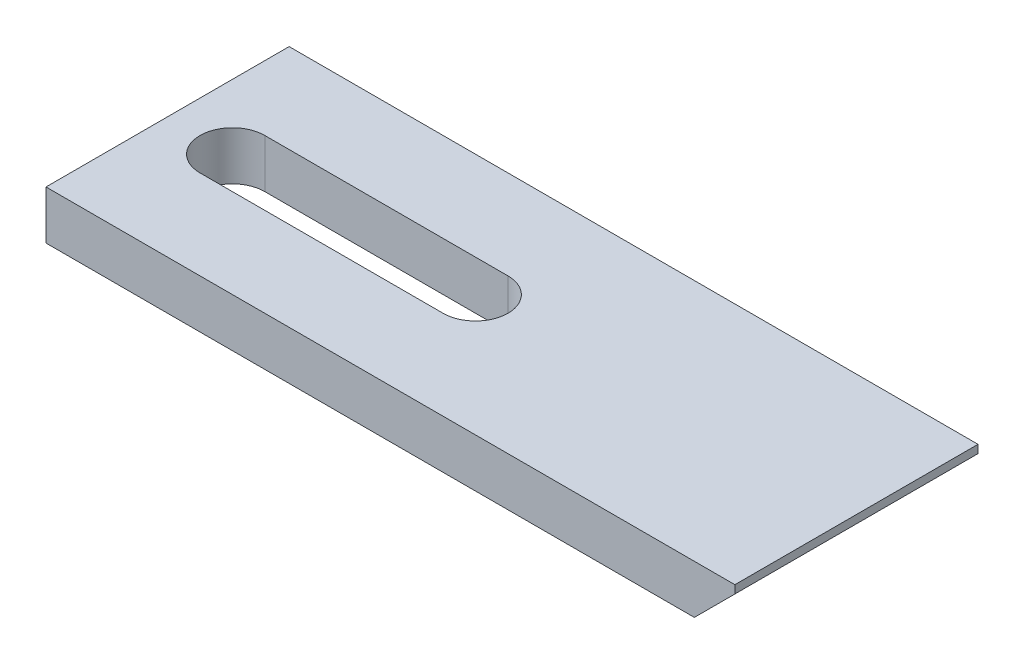
ISO-10303-21;
HEADER;
FILE_DESCRIPTION(('STEP AP214'),'2;1');
FILE_NAME('part.step','',(''),(''),'','','');
FILE_SCHEMA(('AUTOMOTIVE_DESIGN { 1 0 10303 214 1 1 1 1 }'));
ENDSEC;
DATA;
#1=APPLICATION_CONTEXT('core data for automotive mechanical design processes');
#2=APPLICATION_PROTOCOL_DEFINITION('international standard','automotive_design',2000,#1);
#3=PRODUCT_CONTEXT('',#1,'mechanical');
#4=PRODUCT('Part','Part','',(#3));
#5=PRODUCT_RELATED_PRODUCT_CATEGORY('part','',(#4));
#6=PRODUCT_DEFINITION_FORMATION('','',#4);
#7=PRODUCT_DEFINITION_CONTEXT('part definition',#1,'design');
#8=PRODUCT_DEFINITION('design','',#6,#7);
#9=PRODUCT_DEFINITION_SHAPE('','',#8);
#10=(LENGTH_UNIT() NAMED_UNIT(*) SI_UNIT(.MILLI.,.METRE.));
#11=(NAMED_UNIT(*) PLANE_ANGLE_UNIT() SI_UNIT($,.RADIAN.));
#12=(NAMED_UNIT(*) SI_UNIT($,.STERADIAN.) SOLID_ANGLE_UNIT());
#13=UNCERTAINTY_MEASURE_WITH_UNIT(LENGTH_MEASURE(1.E-05),#10,'distance_accuracy_value','');
#14=(GEOMETRIC_REPRESENTATION_CONTEXT(3) GLOBAL_UNCERTAINTY_ASSIGNED_CONTEXT((#13)) GLOBAL_UNIT_ASSIGNED_CONTEXT((#10,
#11,#12)) REPRESENTATION_CONTEXT('',''));
#15=CARTESIAN_POINT('',(0.,0.,0.));
#16=DIRECTION('',(0.,0.,1.));
#17=DIRECTION('',(1.,0.,0.));
#18=AXIS2_PLACEMENT_3D('',#15,#16,#17);
#19=CARTESIAN_POINT('',(-42.5,6.00000000000001,-15.));
#20=DIRECTION('',(0.,1.,0.));
#21=DIRECTION('',(0.,0.,-1.));
#22=AXIS2_PLACEMENT_3D('',#19,#20,#21);
#23=PLANE('',#22);
#24=DIRECTION('',(-1.,0.,0.));
#25=VECTOR('',#24,1.);
#26=CARTESIAN_POINT('',(-34.5000000000012,6.00000000000001,4.));
#27=LINE('',#26,#25);
#28=CARTESIAN_POINT('',(-4.50000000000117,6.00000000000001,4.));
#29=VERTEX_POINT('',#28);
#30=CARTESIAN_POINT('',(-34.5000000000012,6.00000000000001,4.));
#31=VERTEX_POINT('',#30);
#32=EDGE_CURVE('E148',#29,#31,#27,.T.);
#33=ORIENTED_EDGE('',*,*,#32,.T.);
#34=CARTESIAN_POINT('',(-34.5000000000001,6.00000000000001,0.));
#35=DIRECTION('',(0.,-1.,0.));
#36=DIRECTION('',(0.,0.,-1.));
#37=AXIS2_PLACEMENT_3D('',#34,#35,#36);
#38=CIRCLE('',#37,4.);
#39=CARTESIAN_POINT('',(-34.499999999999,6.00000000000001,-4.));
#40=VERTEX_POINT('',#39);
#41=EDGE_CURVE('E152',#31,#40,#38,.T.);
#42=ORIENTED_EDGE('',*,*,#41,.T.);
#43=DIRECTION('',(1.,0.,0.));
#44=VECTOR('',#43,1.);
#45=CARTESIAN_POINT('',(-34.499999999999,6.00000000000001,-4.));
#46=LINE('',#45,#44);
#47=CARTESIAN_POINT('',(-4.49999999999895,6.00000000000001,-4.));
#48=VERTEX_POINT('',#47);
#49=EDGE_CURVE('E161',#40,#48,#46,.T.);
#50=ORIENTED_EDGE('',*,*,#49,.T.);
#51=CARTESIAN_POINT('',(-4.50000000000006,6.00000000000001,0.));
#52=DIRECTION('',(0.,-1.,0.));
#53=DIRECTION('',(0.,0.,1.));
#54=AXIS2_PLACEMENT_3D('',#51,#52,#53);
#55=CIRCLE('',#54,4.);
#56=EDGE_CURVE('E168',#48,#29,#55,.T.);
#57=ORIENTED_EDGE('',*,*,#56,.T.);
#58=EDGE_LOOP('',(#33,#42,#50,#57));
#59=FACE_BOUND('',#58,.T.);
#60=DIRECTION('',(0.,0.,-1.));
#61=VECTOR('',#60,1.);
#62=CARTESIAN_POINT('',(-42.5000000000001,6.00000000000001,15.));
#63=LINE('',#62,#61);
#64=CARTESIAN_POINT('',(-42.5000000000001,6.00000000000001,15.));
#65=VERTEX_POINT('',#64);
#66=CARTESIAN_POINT('',(-42.5,6.00000000000001,-15.));
#67=VERTEX_POINT('',#66);
#68=EDGE_CURVE('E130',#65,#67,#63,.T.);
#69=ORIENTED_EDGE('',*,*,#68,.F.);
#70=DIRECTION('',(-1.,0.,0.));
#71=VECTOR('',#70,1.);
#72=CARTESIAN_POINT('',(-42.5000000000001,6.00000000000001,15.));
#73=LINE('',#72,#71);
#74=CARTESIAN_POINT('',(42.5,6.00000000000001,15.));
#75=VERTEX_POINT('',#74);
#76=EDGE_CURVE('E126',#75,#65,#73,.T.);
#77=ORIENTED_EDGE('',*,*,#76,.F.);
#78=DIRECTION('',(0.,0.,1.));
#79=VECTOR('',#78,1.);
#80=CARTESIAN_POINT('',(42.5,6.00000000000001,15.));
#81=LINE('',#80,#79);
#82=CARTESIAN_POINT('',(42.5,6.00000000000001,-15.));
#83=VERTEX_POINT('',#82);
#84=EDGE_CURVE('E122',#83,#75,#81,.T.);
#85=ORIENTED_EDGE('',*,*,#84,.F.);
#86=DIRECTION('',(1.,0.,0.));
#87=VECTOR('',#86,1.);
#88=CARTESIAN_POINT('',(-42.5,6.00000000000001,-15.));
#89=LINE('',#88,#87);
#90=EDGE_CURVE('E140',#67,#83,#89,.T.);
#91=ORIENTED_EDGE('',*,*,#90,.F.);
#92=EDGE_LOOP('',(#69,#77,#85,#91));
#93=FACE_BOUND('',#92,.T.);
#94=ADVANCED_FACE('F33',(#59,#93),#23,.T.);
#95=CARTESIAN_POINT('',(-42.5,0.,-15.));
#96=DIRECTION('',(0.,1.,0.));
#97=DIRECTION('',(0.,0.,-1.));
#98=AXIS2_PLACEMENT_3D('',#95,#96,#97);
#99=PLANE('',#98);
#100=CARTESIAN_POINT('',(-4.50000000000006,0.,0.));
#101=DIRECTION('',(0.,-1.,0.));
#102=DIRECTION('',(0.,0.,1.));
#103=AXIS2_PLACEMENT_3D('',#100,#101,#102);
#104=CIRCLE('',#103,4.);
#105=CARTESIAN_POINT('',(-4.49999999999895,0.,-4.));
#106=VERTEX_POINT('',#105);
#107=CARTESIAN_POINT('',(-4.50000000000117,0.,4.));
#108=VERTEX_POINT('',#107);
#109=EDGE_CURVE('E169',#106,#108,#104,.T.);
#110=ORIENTED_EDGE('',*,*,#109,.F.);
#111=DIRECTION('',(1.,0.,0.));
#112=VECTOR('',#111,1.);
#113=CARTESIAN_POINT('',(-34.499999999999,0.,-4.));
#114=LINE('',#113,#112);
#115=CARTESIAN_POINT('',(-34.499999999999,0.,-4.));
#116=VERTEX_POINT('',#115);
#117=EDGE_CURVE('E153',#116,#106,#114,.T.);
#118=ORIENTED_EDGE('',*,*,#117,.F.);
#119=CARTESIAN_POINT('',(-34.5000000000001,0.,0.));
#120=DIRECTION('',(0.,-1.,0.));
#121=DIRECTION('',(0.,0.,-1.));
#122=AXIS2_PLACEMENT_3D('',#119,#120,#121);
#123=CIRCLE('',#122,4.);
#124=CARTESIAN_POINT('',(-34.5000000000012,0.,4.));
#125=VERTEX_POINT('',#124);
#126=EDGE_CURVE('E155',#125,#116,#123,.T.);
#127=ORIENTED_EDGE('',*,*,#126,.F.);
#128=DIRECTION('',(-1.,0.,0.));
#129=VECTOR('',#128,1.);
#130=CARTESIAN_POINT('',(-34.5000000000012,0.,4.));
#131=LINE('',#130,#129);
#132=EDGE_CURVE('E149',#108,#125,#131,.T.);
#133=ORIENTED_EDGE('',*,*,#132,.F.);
#134=EDGE_LOOP('',(#110,#118,#127,#133));
#135=FACE_BOUND('',#134,.T.);
#136=DIRECTION('',(-1.,0.,0.));
#137=VECTOR('',#136,1.);
#138=CARTESIAN_POINT('',(-42.5000000000001,0.,15.));
#139=LINE('',#138,#137);
#140=CARTESIAN_POINT('',(37.5,0.,15.));
#141=VERTEX_POINT('',#140);
#142=CARTESIAN_POINT('',(-42.5000000000001,0.,15.));
#143=VERTEX_POINT('',#142);
#144=EDGE_CURVE('E110',#141,#143,#139,.T.);
#145=ORIENTED_EDGE('',*,*,#144,.T.);
#146=DIRECTION('',(0.,0.,-1.));
#147=VECTOR('',#146,1.);
#148=CARTESIAN_POINT('',(-42.5000000000001,0.,15.));
#149=LINE('',#148,#147);
#150=CARTESIAN_POINT('',(-42.5,0.,-15.));
#151=VERTEX_POINT('',#150);
#152=EDGE_CURVE('E134',#143,#151,#149,.T.);
#153=ORIENTED_EDGE('',*,*,#152,.T.);
#154=DIRECTION('',(1.,0.,0.));
#155=VECTOR('',#154,1.);
#156=CARTESIAN_POINT('',(-42.5,0.,-15.));
#157=LINE('',#156,#155);
#158=CARTESIAN_POINT('',(37.5,0.,-15.));
#159=VERTEX_POINT('',#158);
#160=EDGE_CURVE('E131',#151,#159,#157,.T.);
#161=ORIENTED_EDGE('',*,*,#160,.T.);
#162=DIRECTION('',(0.,0.,-1.));
#163=VECTOR('',#162,1.);
#164=CARTESIAN_POINT('',(37.5,0.,15.));
#165=LINE('',#164,#163);
#166=EDGE_CURVE('E118',#141,#159,#165,.T.);
#167=ORIENTED_EDGE('',*,*,#166,.F.);
#168=EDGE_LOOP('',(#145,#153,#161,#167));
#169=FACE_BOUND('',#168,.T.);
#170=ADVANCED_FACE('F178',(#135,#169),#99,.F.);
#171=CARTESIAN_POINT('',(-42.5000000000001,6.00000000000001,15.));
#172=DIRECTION('',(1.,0.,0.));
#173=DIRECTION('',(0.,0.,1.));
#174=AXIS2_PLACEMENT_3D('',#171,#172,#173);
#175=PLANE('',#174);
#176=ORIENTED_EDGE('',*,*,#152,.F.);
#177=DIRECTION('',(0.,-1.,0.));
#178=VECTOR('',#177,1.);
#179=CARTESIAN_POINT('',(-42.5000000000001,6.00000000000001,15.));
#180=LINE('',#179,#178);
#181=EDGE_CURVE('E124',#65,#143,#180,.T.);
#182=ORIENTED_EDGE('',*,*,#181,.F.);
#183=ORIENTED_EDGE('',*,*,#68,.T.);
#184=DIRECTION('',(0.,-1.,0.));
#185=VECTOR('',#184,1.);
#186=CARTESIAN_POINT('',(-42.5,6.00000000000001,-15.));
#187=LINE('',#186,#185);
#188=EDGE_CURVE('E11',#67,#151,#187,.T.);
#189=ORIENTED_EDGE('',*,*,#188,.T.);
#190=EDGE_LOOP('',(#176,#182,#183,#189));
#191=FACE_BOUND('',#190,.T.);
#192=ADVANCED_FACE('F35',(#191),#175,.F.);
#193=CARTESIAN_POINT('',(-42.5,6.00000000000001,-15.));
#194=DIRECTION('',(0.,0.,1.));
#195=DIRECTION('',(-1.,0.,0.));
#196=AXIS2_PLACEMENT_3D('',#193,#194,#195);
#197=PLANE('',#196);
#198=ORIENTED_EDGE('',*,*,#160,.F.);
#199=ORIENTED_EDGE('',*,*,#188,.F.);
#200=ORIENTED_EDGE('',*,*,#90,.T.);
#201=DIRECTION('',(0.,-1.,0.));
#202=VECTOR('',#201,1.);
#203=CARTESIAN_POINT('',(42.5,6.00000000000001,-15.));
#204=LINE('',#203,#202);
#205=CARTESIAN_POINT('',(42.5,5.,-15.));
#206=VERTEX_POINT('',#205);
#207=EDGE_CURVE('E41',#83,#206,#204,.T.);
#208=ORIENTED_EDGE('',*,*,#207,.T.);
#209=DIRECTION('',(-0.707106781186547,-0.707106781186548,0.));
#210=VECTOR('',#209,1.);
#211=CARTESIAN_POINT('',(42.5,5.,-15.));
#212=LINE('',#211,#210);
#213=EDGE_CURVE('E112',#206,#159,#212,.T.);
#214=ORIENTED_EDGE('',*,*,#213,.T.);
#215=EDGE_LOOP('',(#198,#199,#200,#208,#214));
#216=FACE_BOUND('',#215,.T.);
#217=ADVANCED_FACE('F176',(#216),#197,.F.);
#218=CARTESIAN_POINT('',(42.5,6.00000000000001,15.));
#219=DIRECTION('',(-1.,0.,0.));
#220=DIRECTION('',(0.,0.,-1.));
#221=AXIS2_PLACEMENT_3D('',#218,#219,#220);
#222=PLANE('',#221);
#223=ORIENTED_EDGE('',*,*,#207,.F.);
#224=ORIENTED_EDGE('',*,*,#84,.T.);
#225=DIRECTION('',(0.,-1.,0.));
#226=VECTOR('',#225,1.);
#227=CARTESIAN_POINT('',(42.5,6.00000000000001,15.));
#228=LINE('',#227,#226);
#229=CARTESIAN_POINT('',(42.5,5.,15.));
#230=VERTEX_POINT('',#229);
#231=EDGE_CURVE('E107',#75,#230,#228,.T.);
#232=ORIENTED_EDGE('',*,*,#231,.T.);
#233=DIRECTION('',(0.,0.,-1.));
#234=VECTOR('',#233,1.);
#235=CARTESIAN_POINT('',(42.5,5.,15.));
#236=LINE('',#235,#234);
#237=EDGE_CURVE('E111',#230,#206,#236,.T.);
#238=ORIENTED_EDGE('',*,*,#237,.T.);
#239=EDGE_LOOP('',(#223,#224,#232,#238));
#240=FACE_BOUND('',#239,.T.);
#241=ADVANCED_FACE('F120',(#240),#222,.F.);
#242=CARTESIAN_POINT('',(-42.5000000000001,6.00000000000001,15.));
#243=DIRECTION('',(0.,0.,-1.));
#244=DIRECTION('',(1.,0.,0.));
#245=AXIS2_PLACEMENT_3D('',#242,#243,#244);
#246=PLANE('',#245);
#247=ORIENTED_EDGE('',*,*,#231,.F.);
#248=ORIENTED_EDGE('',*,*,#76,.T.);
#249=ORIENTED_EDGE('',*,*,#181,.T.);
#250=ORIENTED_EDGE('',*,*,#144,.F.);
#251=DIRECTION('',(-0.707106781186547,-0.707106781186548,0.));
#252=VECTOR('',#251,1.);
#253=CARTESIAN_POINT('',(42.5,5.,15.));
#254=LINE('',#253,#252);
#255=EDGE_CURVE('E48',#230,#141,#254,.T.);
#256=ORIENTED_EDGE('',*,*,#255,.F.);
#257=EDGE_LOOP('',(#247,#248,#249,#250,#256));
#258=FACE_BOUND('',#257,.T.);
#259=ADVANCED_FACE('F104',(#258),#246,.F.);
#260=CARTESIAN_POINT('',(-34.5000000000001,6.00000000000001,0.));
#261=DIRECTION('',(0.,-1.,0.));
#262=DIRECTION('',(0.,0.,1.));
#263=AXIS2_PLACEMENT_3D('',#260,#261,#262);
#264=CYLINDRICAL_SURFACE('',#263,4.);
#265=ORIENTED_EDGE('',*,*,#126,.T.);
#266=DIRECTION('',(0.,-1.,0.));
#267=VECTOR('',#266,1.);
#268=CARTESIAN_POINT('',(-34.499999999999,6.00000000000001,-4.));
#269=LINE('',#268,#267);
#270=EDGE_CURVE('E137',#40,#116,#269,.T.);
#271=ORIENTED_EDGE('',*,*,#270,.F.);
#272=ORIENTED_EDGE('',*,*,#41,.F.);
#273=DIRECTION('',(0.,-1.,0.));
#274=VECTOR('',#273,1.);
#275=CARTESIAN_POINT('',(-34.5000000000012,6.00000000000001,4.));
#276=LINE('',#275,#274);
#277=EDGE_CURVE('E146',#31,#125,#276,.T.);
#278=ORIENTED_EDGE('',*,*,#277,.T.);
#279=EDGE_LOOP('',(#265,#271,#272,#278));
#280=FACE_BOUND('',#279,.T.);
#281=ADVANCED_FACE('F193',(#280),#264,.F.);
#282=CARTESIAN_POINT('',(-34.499999999999,6.00000000000001,-4.));
#283=DIRECTION('',(0.,0.,1.));
#284=DIRECTION('',(-1.,0.,0.));
#285=AXIS2_PLACEMENT_3D('',#282,#283,#284);
#286=PLANE('',#285);
#287=ORIENTED_EDGE('',*,*,#117,.T.);
#288=DIRECTION('',(0.,-1.,0.));
#289=VECTOR('',#288,1.);
#290=CARTESIAN_POINT('',(-4.49999999999895,6.00000000000001,-4.));
#291=LINE('',#290,#289);
#292=EDGE_CURVE('E56',#48,#106,#291,.T.);
#293=ORIENTED_EDGE('',*,*,#292,.F.);
#294=ORIENTED_EDGE('',*,*,#49,.F.);
#295=ORIENTED_EDGE('',*,*,#270,.T.);
#296=EDGE_LOOP('',(#287,#293,#294,#295));
#297=FACE_BOUND('',#296,.T.);
#298=ADVANCED_FACE('F228',(#297),#286,.T.);
#299=CARTESIAN_POINT('',(-34.5000000000012,6.00000000000001,4.));
#300=DIRECTION('',(0.,0.,-1.));
#301=DIRECTION('',(1.,0.,0.));
#302=AXIS2_PLACEMENT_3D('',#299,#300,#301);
#303=PLANE('',#302);
#304=ORIENTED_EDGE('',*,*,#132,.T.);
#305=ORIENTED_EDGE('',*,*,#277,.F.);
#306=ORIENTED_EDGE('',*,*,#32,.F.);
#307=DIRECTION('',(0.,-1.,0.));
#308=VECTOR('',#307,1.);
#309=CARTESIAN_POINT('',(-4.50000000000117,6.00000000000001,4.));
#310=LINE('',#309,#308);
#311=EDGE_CURVE('E158',#29,#108,#310,.T.);
#312=ORIENTED_EDGE('',*,*,#311,.T.);
#313=EDGE_LOOP('',(#304,#305,#306,#312));
#314=FACE_BOUND('',#313,.T.);
#315=ADVANCED_FACE('F235',(#314),#303,.T.);
#316=CARTESIAN_POINT('',(-4.50000000000006,6.00000000000001,0.));
#317=DIRECTION('',(0.,-1.,0.));
#318=DIRECTION('',(0.,0.,1.));
#319=AXIS2_PLACEMENT_3D('',#316,#317,#318);
#320=CYLINDRICAL_SURFACE('',#319,4.);
#321=ORIENTED_EDGE('',*,*,#109,.T.);
#322=ORIENTED_EDGE('',*,*,#311,.F.);
#323=ORIENTED_EDGE('',*,*,#56,.F.);
#324=ORIENTED_EDGE('',*,*,#292,.T.);
#325=EDGE_LOOP('',(#321,#322,#323,#324));
#326=FACE_BOUND('',#325,.T.);
#327=ADVANCED_FACE('F248',(#326),#320,.F.);
#328=CARTESIAN_POINT('',(42.5,5.,15.));
#329=DIRECTION('',(-0.707106781186548,0.707106781186547,0.));
#330=DIRECTION('',(-0.707106781186547,-0.707106781186548,0.));
#331=AXIS2_PLACEMENT_3D('',#328,#329,#330);
#332=PLANE('',#331);
#333=ORIENTED_EDGE('',*,*,#213,.F.);
#334=ORIENTED_EDGE('',*,*,#237,.F.);
#335=ORIENTED_EDGE('',*,*,#255,.T.);
#336=ORIENTED_EDGE('',*,*,#166,.T.);
#337=EDGE_LOOP('',(#333,#334,#335,#336));
#338=FACE_BOUND('',#337,.T.);
#339=ADVANCED_FACE('F115',(#338),#332,.F.);
#340=CLOSED_SHELL('',(#94,#170,#192,#217,#241,#259,#281,#298,#315,#327,#339));
#341=MANIFOLD_SOLID_BREP('B2',#340);
#342=ADVANCED_BREP_SHAPE_REPRESENTATION('',(#18,#341),#14);
#343=SHAPE_DEFINITION_REPRESENTATION(#9,#342);
ENDSEC;
END-ISO-10303-21;
